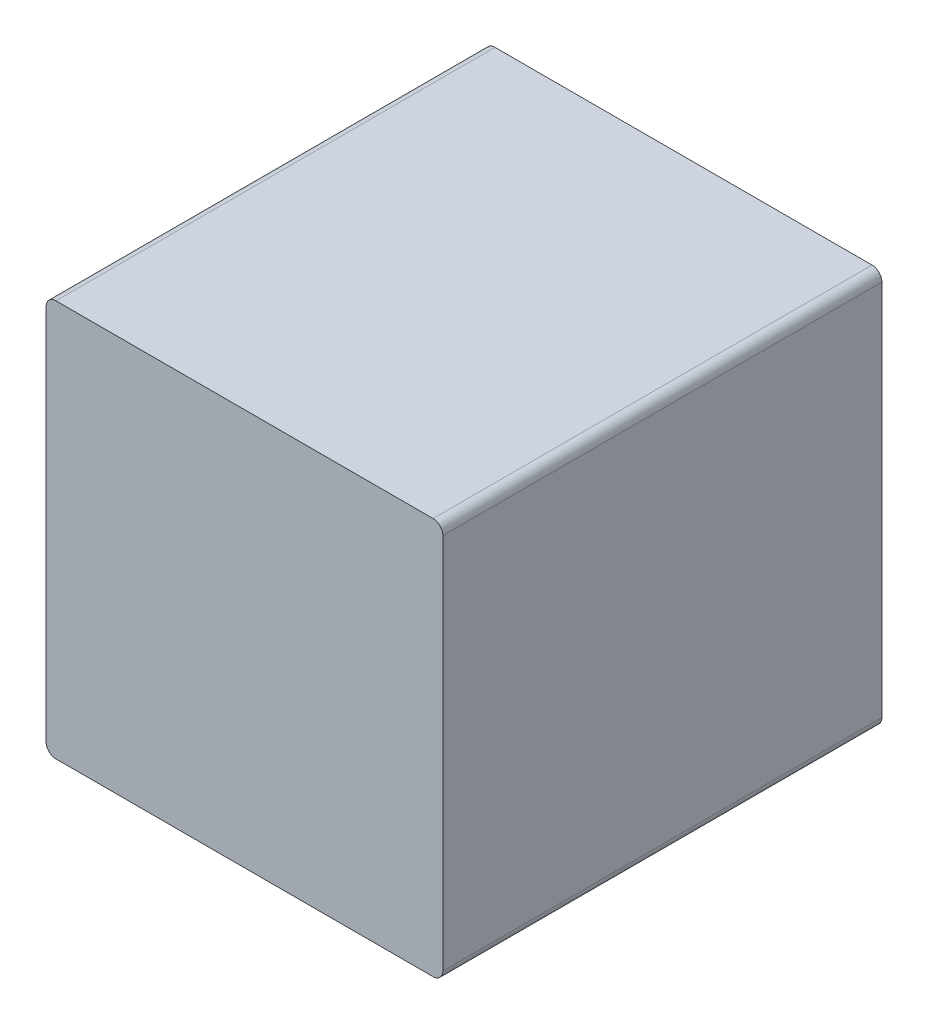
ISO-10303-21;
HEADER;
FILE_DESCRIPTION(('STEP AP214'),'2;1');
FILE_NAME('part.step','',(''),(''),'','','');
FILE_SCHEMA(('AUTOMOTIVE_DESIGN { 1 0 10303 214 1 1 1 1 }'));
ENDSEC;
DATA;
#1=APPLICATION_CONTEXT('core data for automotive mechanical design processes');
#2=APPLICATION_PROTOCOL_DEFINITION('international standard','automotive_design',2000,#1);
#3=PRODUCT_CONTEXT('',#1,'mechanical');
#4=PRODUCT('Part','Part','',(#3));
#5=PRODUCT_RELATED_PRODUCT_CATEGORY('part','',(#4));
#6=PRODUCT_DEFINITION_FORMATION('','',#4);
#7=PRODUCT_DEFINITION_CONTEXT('part definition',#1,'design');
#8=PRODUCT_DEFINITION('design','',#6,#7);
#9=PRODUCT_DEFINITION_SHAPE('','',#8);
#10=(LENGTH_UNIT() NAMED_UNIT(*) SI_UNIT(.MILLI.,.METRE.));
#11=(NAMED_UNIT(*) PLANE_ANGLE_UNIT() SI_UNIT($,.RADIAN.));
#12=(NAMED_UNIT(*) SI_UNIT($,.STERADIAN.) SOLID_ANGLE_UNIT());
#13=UNCERTAINTY_MEASURE_WITH_UNIT(LENGTH_MEASURE(1.E-05),#10,'distance_accuracy_value','');
#14=(GEOMETRIC_REPRESENTATION_CONTEXT(3) GLOBAL_UNCERTAINTY_ASSIGNED_CONTEXT((#13)) GLOBAL_UNIT_ASSIGNED_CONTEXT((#10,
#11,#12)) REPRESENTATION_CONTEXT('',''));
#15=CARTESIAN_POINT('',(0.,0.,0.));
#16=DIRECTION('',(0.,0.,1.));
#17=DIRECTION('',(1.,0.,0.));
#18=AXIS2_PLACEMENT_3D('',#15,#16,#17);
#19=CARTESIAN_POINT('',(-5.755,-5.755,13.4));
#20=DIRECTION('',(0.,0.,-1.));
#21=DIRECTION('',(-1.,0.,0.));
#22=AXIS2_PLACEMENT_3D('',#19,#20,#21);
#23=CYLINDRICAL_SURFACE('',#22,0.300000000000003);
#24=CARTESIAN_POINT('',(-5.755,-5.755,0.));
#25=DIRECTION('',(0.,0.,1.));
#26=DIRECTION('',(1.,0.,0.));
#27=AXIS2_PLACEMENT_3D('',#24,#25,#26);
#28=CIRCLE('',#27,0.300000000000003);
#29=CARTESIAN_POINT('',(-6.055,-5.755,0.));
#30=VERTEX_POINT('',#29);
#31=CARTESIAN_POINT('',(-5.755,-6.055,0.));
#32=VERTEX_POINT('',#31);
#33=EDGE_CURVE('E137',#30,#32,#28,.T.);
#34=ORIENTED_EDGE('',*,*,#33,.T.);
#35=DIRECTION('',(0.,0.,-1.));
#36=VECTOR('',#35,1.);
#37=CARTESIAN_POINT('',(-5.755,-6.055,13.4));
#38=LINE('',#37,#36);
#39=CARTESIAN_POINT('',(-5.755,-6.055,13.4));
#40=VERTEX_POINT('',#39);
#41=EDGE_CURVE('E11',#40,#32,#38,.T.);
#42=ORIENTED_EDGE('',*,*,#41,.F.);
#43=CARTESIAN_POINT('',(-5.755,-5.755,13.4));
#44=DIRECTION('',(0.,0.,1.));
#45=DIRECTION('',(1.,0.,0.));
#46=AXIS2_PLACEMENT_3D('',#43,#44,#45);
#47=CIRCLE('',#46,0.300000000000003);
#48=CARTESIAN_POINT('',(-6.055,-5.755,13.4));
#49=VERTEX_POINT('',#48);
#50=EDGE_CURVE('E151',#49,#40,#47,.T.);
#51=ORIENTED_EDGE('',*,*,#50,.F.);
#52=DIRECTION('',(0.,0.,-1.));
#53=VECTOR('',#52,1.);
#54=CARTESIAN_POINT('',(-6.055,-5.755,13.4));
#55=LINE('',#54,#53);
#56=EDGE_CURVE('E132',#49,#30,#55,.T.);
#57=ORIENTED_EDGE('',*,*,#56,.T.);
#58=EDGE_LOOP('',(#34,#42,#51,#57));
#59=FACE_BOUND('',#58,.T.);
#60=ADVANCED_FACE('F41',(#59),#23,.T.);
#61=CARTESIAN_POINT('',(-5.755,-6.055,13.4));
#62=DIRECTION('',(0.,1.,0.));
#63=DIRECTION('',(0.,0.,1.));
#64=AXIS2_PLACEMENT_3D('',#61,#62,#63);
#65=PLANE('',#64);
#66=DIRECTION('',(1.,0.,0.));
#67=VECTOR('',#66,1.);
#68=CARTESIAN_POINT('',(-5.755,-6.055,0.));
#69=LINE('',#68,#67);
#70=CARTESIAN_POINT('',(5.755,-6.055,0.));
#71=VERTEX_POINT('',#70);
#72=EDGE_CURVE('E140',#32,#71,#69,.T.);
#73=ORIENTED_EDGE('',*,*,#72,.T.);
#74=DIRECTION('',(0.,0.,-1.));
#75=VECTOR('',#74,1.);
#76=CARTESIAN_POINT('',(5.755,-6.055,13.4));
#77=LINE('',#76,#75);
#78=CARTESIAN_POINT('',(5.755,-6.055,13.4));
#79=VERTEX_POINT('',#78);
#80=EDGE_CURVE('E47',#79,#71,#77,.T.);
#81=ORIENTED_EDGE('',*,*,#80,.F.);
#82=DIRECTION('',(1.,0.,0.));
#83=VECTOR('',#82,1.);
#84=CARTESIAN_POINT('',(-5.755,-6.055,13.4));
#85=LINE('',#84,#83);
#86=EDGE_CURVE('E99',#40,#79,#85,.T.);
#87=ORIENTED_EDGE('',*,*,#86,.F.);
#88=ORIENTED_EDGE('',*,*,#41,.T.);
#89=EDGE_LOOP('',(#73,#81,#87,#88));
#90=FACE_BOUND('',#89,.T.);
#91=ADVANCED_FACE('F188',(#90),#65,.F.);
#92=CARTESIAN_POINT('',(5.755,-5.755,13.4));
#93=DIRECTION('',(0.,0.,-1.));
#94=DIRECTION('',(-1.,0.,0.));
#95=AXIS2_PLACEMENT_3D('',#92,#93,#94);
#96=CYLINDRICAL_SURFACE('',#95,0.300000000000003);
#97=CARTESIAN_POINT('',(5.755,-5.755,0.));
#98=DIRECTION('',(0.,0.,1.));
#99=DIRECTION('',(1.,0.,0.));
#100=AXIS2_PLACEMENT_3D('',#97,#98,#99);
#101=CIRCLE('',#100,0.300000000000003);
#102=CARTESIAN_POINT('',(6.055,-5.755,0.));
#103=VERTEX_POINT('',#102);
#104=EDGE_CURVE('E142',#71,#103,#101,.T.);
#105=ORIENTED_EDGE('',*,*,#104,.T.);
#106=DIRECTION('',(0.,0.,-1.));
#107=VECTOR('',#106,1.);
#108=CARTESIAN_POINT('',(6.055,-5.755,13.4));
#109=LINE('',#108,#107);
#110=CARTESIAN_POINT('',(6.055,-5.755,13.4));
#111=VERTEX_POINT('',#110);
#112=EDGE_CURVE('E158',#111,#103,#109,.T.);
#113=ORIENTED_EDGE('',*,*,#112,.F.);
#114=CARTESIAN_POINT('',(5.755,-5.755,13.4));
#115=DIRECTION('',(0.,0.,1.));
#116=DIRECTION('',(1.,0.,0.));
#117=AXIS2_PLACEMENT_3D('',#114,#115,#116);
#118=CIRCLE('',#117,0.300000000000003);
#119=EDGE_CURVE('E167',#79,#111,#118,.T.);
#120=ORIENTED_EDGE('',*,*,#119,.F.);
#121=ORIENTED_EDGE('',*,*,#80,.T.);
#122=EDGE_LOOP('',(#105,#113,#120,#121));
#123=FACE_BOUND('',#122,.T.);
#124=ADVANCED_FACE('F163',(#123),#96,.T.);
#125=CARTESIAN_POINT('',(6.055,-5.755,13.4));
#126=DIRECTION('',(-1.,0.,0.));
#127=DIRECTION('',(0.,0.,1.));
#128=AXIS2_PLACEMENT_3D('',#125,#126,#127);
#129=PLANE('',#128);
#130=DIRECTION('',(0.,1.,0.));
#131=VECTOR('',#130,1.);
#132=CARTESIAN_POINT('',(6.055,-5.755,0.));
#133=LINE('',#132,#131);
#134=CARTESIAN_POINT('',(6.055,5.755,0.));
#135=VERTEX_POINT('',#134);
#136=EDGE_CURVE('E145',#103,#135,#133,.T.);
#137=ORIENTED_EDGE('',*,*,#136,.T.);
#138=DIRECTION('',(0.,0.,-1.));
#139=VECTOR('',#138,1.);
#140=CARTESIAN_POINT('',(6.055,5.755,13.4));
#141=LINE('',#140,#139);
#142=CARTESIAN_POINT('',(6.055,5.755,13.4));
#143=VERTEX_POINT('',#142);
#144=EDGE_CURVE('E154',#143,#135,#141,.T.);
#145=ORIENTED_EDGE('',*,*,#144,.F.);
#146=DIRECTION('',(0.,1.,0.));
#147=VECTOR('',#146,1.);
#148=CARTESIAN_POINT('',(6.055,-5.755,13.4));
#149=LINE('',#148,#147);
#150=EDGE_CURVE('E179',#111,#143,#149,.T.);
#151=ORIENTED_EDGE('',*,*,#150,.F.);
#152=ORIENTED_EDGE('',*,*,#112,.T.);
#153=EDGE_LOOP('',(#137,#145,#151,#152));
#154=FACE_BOUND('',#153,.T.);
#155=ADVANCED_FACE('F175',(#154),#129,.F.);
#156=CARTESIAN_POINT('',(5.755,5.755,13.4));
#157=DIRECTION('',(0.,0.,-1.));
#158=DIRECTION('',(-1.,0.,0.));
#159=AXIS2_PLACEMENT_3D('',#156,#157,#158);
#160=CYLINDRICAL_SURFACE('',#159,0.300000000000003);
#161=CARTESIAN_POINT('',(5.755,5.755,0.));
#162=DIRECTION('',(0.,0.,1.));
#163=DIRECTION('',(1.,0.,0.));
#164=AXIS2_PLACEMENT_3D('',#161,#162,#163);
#165=CIRCLE('',#164,0.300000000000003);
#166=CARTESIAN_POINT('',(5.755,6.055,0.));
#167=VERTEX_POINT('',#166);
#168=EDGE_CURVE('E148',#135,#167,#165,.T.);
#169=ORIENTED_EDGE('',*,*,#168,.T.);
#170=DIRECTION('',(0.,0.,-1.));
#171=VECTOR('',#170,1.);
#172=CARTESIAN_POINT('',(5.755,6.055,13.4));
#173=LINE('',#172,#171);
#174=CARTESIAN_POINT('',(5.755,6.055,13.4));
#175=VERTEX_POINT('',#174);
#176=EDGE_CURVE('E126',#175,#167,#173,.T.);
#177=ORIENTED_EDGE('',*,*,#176,.F.);
#178=CARTESIAN_POINT('',(5.755,5.755,13.4));
#179=DIRECTION('',(0.,0.,1.));
#180=DIRECTION('',(1.,0.,0.));
#181=AXIS2_PLACEMENT_3D('',#178,#179,#180);
#182=CIRCLE('',#181,0.300000000000003);
#183=EDGE_CURVE('E120',#143,#175,#182,.T.);
#184=ORIENTED_EDGE('',*,*,#183,.F.);
#185=ORIENTED_EDGE('',*,*,#144,.T.);
#186=EDGE_LOOP('',(#169,#177,#184,#185));
#187=FACE_BOUND('',#186,.T.);
#188=ADVANCED_FACE('F177',(#187),#160,.T.);
#189=CARTESIAN_POINT('',(5.755,6.055,13.4));
#190=DIRECTION('',(0.,-1.,0.));
#191=DIRECTION('',(0.,0.,-1.));
#192=AXIS2_PLACEMENT_3D('',#189,#190,#191);
#193=PLANE('',#192);
#194=DIRECTION('',(-1.,0.,0.));
#195=VECTOR('',#194,1.);
#196=CARTESIAN_POINT('',(5.755,6.055,0.));
#197=LINE('',#196,#195);
#198=CARTESIAN_POINT('',(-5.755,6.055,0.));
#199=VERTEX_POINT('',#198);
#200=EDGE_CURVE('E130',#167,#199,#197,.T.);
#201=ORIENTED_EDGE('',*,*,#200,.T.);
#202=DIRECTION('',(0.,0.,-1.));
#203=VECTOR('',#202,1.);
#204=CARTESIAN_POINT('',(-5.755,6.055,13.4));
#205=LINE('',#204,#203);
#206=CARTESIAN_POINT('',(-5.755,6.055,13.4));
#207=VERTEX_POINT('',#206);
#208=EDGE_CURVE('E123',#207,#199,#205,.T.);
#209=ORIENTED_EDGE('',*,*,#208,.F.);
#210=DIRECTION('',(-1.,0.,0.));
#211=VECTOR('',#210,1.);
#212=CARTESIAN_POINT('',(5.755,6.055,13.4));
#213=LINE('',#212,#211);
#214=EDGE_CURVE('E114',#175,#207,#213,.T.);
#215=ORIENTED_EDGE('',*,*,#214,.F.);
#216=ORIENTED_EDGE('',*,*,#176,.T.);
#217=EDGE_LOOP('',(#201,#209,#215,#216));
#218=FACE_BOUND('',#217,.T.);
#219=ADVANCED_FACE('F125',(#218),#193,.F.);
#220=CARTESIAN_POINT('',(-5.755,5.755,13.4));
#221=DIRECTION('',(0.,0.,-1.));
#222=DIRECTION('',(-1.,0.,0.));
#223=AXIS2_PLACEMENT_3D('',#220,#221,#222);
#224=CYLINDRICAL_SURFACE('',#223,0.300000000000003);
#225=CARTESIAN_POINT('',(-5.755,5.755,0.));
#226=DIRECTION('',(0.,0.,1.));
#227=DIRECTION('',(1.,0.,0.));
#228=AXIS2_PLACEMENT_3D('',#225,#226,#227);
#229=CIRCLE('',#228,0.300000000000003);
#230=CARTESIAN_POINT('',(-6.055,5.755,0.));
#231=VERTEX_POINT('',#230);
#232=EDGE_CURVE('E88',#199,#231,#229,.T.);
#233=ORIENTED_EDGE('',*,*,#232,.T.);
#234=DIRECTION('',(0.,0.,-1.));
#235=VECTOR('',#234,1.);
#236=CARTESIAN_POINT('',(-6.055,5.755,13.4));
#237=LINE('',#236,#235);
#238=CARTESIAN_POINT('',(-6.055,5.755,13.4));
#239=VERTEX_POINT('',#238);
#240=EDGE_CURVE('E129',#239,#231,#237,.T.);
#241=ORIENTED_EDGE('',*,*,#240,.F.);
#242=CARTESIAN_POINT('',(-5.755,5.755,13.4));
#243=DIRECTION('',(0.,0.,1.));
#244=DIRECTION('',(1.,0.,0.));
#245=AXIS2_PLACEMENT_3D('',#242,#243,#244);
#246=CIRCLE('',#245,0.300000000000003);
#247=EDGE_CURVE('E119',#207,#239,#246,.T.);
#248=ORIENTED_EDGE('',*,*,#247,.F.);
#249=ORIENTED_EDGE('',*,*,#208,.T.);
#250=EDGE_LOOP('',(#233,#241,#248,#249));
#251=FACE_BOUND('',#250,.T.);
#252=ADVANCED_FACE('F133',(#251),#224,.T.);
#253=CARTESIAN_POINT('',(-6.055,5.755,13.4));
#254=DIRECTION('',(1.,0.,0.));
#255=DIRECTION('',(0.,0.,-1.));
#256=AXIS2_PLACEMENT_3D('',#253,#254,#255);
#257=PLANE('',#256);
#258=DIRECTION('',(0.,-1.,0.));
#259=VECTOR('',#258,1.);
#260=CARTESIAN_POINT('',(-6.055,5.755,0.));
#261=LINE('',#260,#259);
#262=EDGE_CURVE('E95',#231,#30,#261,.T.);
#263=ORIENTED_EDGE('',*,*,#262,.T.);
#264=ORIENTED_EDGE('',*,*,#56,.F.);
#265=DIRECTION('',(0.,-1.,0.));
#266=VECTOR('',#265,1.);
#267=CARTESIAN_POINT('',(-6.055,5.755,13.4));
#268=LINE('',#267,#266);
#269=EDGE_CURVE('E60',#239,#49,#268,.T.);
#270=ORIENTED_EDGE('',*,*,#269,.F.);
#271=ORIENTED_EDGE('',*,*,#240,.T.);
#272=EDGE_LOOP('',(#263,#264,#270,#271));
#273=FACE_BOUND('',#272,.T.);
#274=ADVANCED_FACE('F205',(#273),#257,.F.);
#275=CARTESIAN_POINT('',(-5.755,-5.755,13.4));
#276=DIRECTION('',(0.,0.,1.));
#277=DIRECTION('',(1.,0.,0.));
#278=AXIS2_PLACEMENT_3D('',#275,#276,#277);
#279=PLANE('',#278);
#280=ORIENTED_EDGE('',*,*,#50,.T.);
#281=ORIENTED_EDGE('',*,*,#86,.T.);
#282=ORIENTED_EDGE('',*,*,#119,.T.);
#283=ORIENTED_EDGE('',*,*,#150,.T.);
#284=ORIENTED_EDGE('',*,*,#183,.T.);
#285=ORIENTED_EDGE('',*,*,#214,.T.);
#286=ORIENTED_EDGE('',*,*,#247,.T.);
#287=ORIENTED_EDGE('',*,*,#269,.T.);
#288=EDGE_LOOP('',(#280,#281,#282,#283,#284,#285,#286,#287));
#289=FACE_BOUND('',#288,.T.);
#290=ADVANCED_FACE('F113',(#289),#279,.T.);
#291=CARTESIAN_POINT('',(-5.755,-5.755,0.));
#292=DIRECTION('',(0.,0.,1.));
#293=DIRECTION('',(1.,0.,0.));
#294=AXIS2_PLACEMENT_3D('',#291,#292,#293);
#295=PLANE('',#294);
#296=ORIENTED_EDGE('',*,*,#33,.F.);
#297=ORIENTED_EDGE('',*,*,#262,.F.);
#298=ORIENTED_EDGE('',*,*,#232,.F.);
#299=ORIENTED_EDGE('',*,*,#200,.F.);
#300=ORIENTED_EDGE('',*,*,#168,.F.);
#301=ORIENTED_EDGE('',*,*,#136,.F.);
#302=ORIENTED_EDGE('',*,*,#104,.F.);
#303=ORIENTED_EDGE('',*,*,#72,.F.);
#304=EDGE_LOOP('',(#296,#297,#298,#299,#300,#301,#302,#303));
#305=FACE_BOUND('',#304,.T.);
#306=ADVANCED_FACE('F168',(#305),#295,.F.);
#307=CLOSED_SHELL('',(#60,#91,#124,#155,#188,#219,#252,#274,#290,#306));
#308=MANIFOLD_SOLID_BREP('B2',#307);
#309=ADVANCED_BREP_SHAPE_REPRESENTATION('',(#18,#308),#14);
#310=SHAPE_DEFINITION_REPRESENTATION(#9,#309);
ENDSEC;
END-ISO-10303-21;
